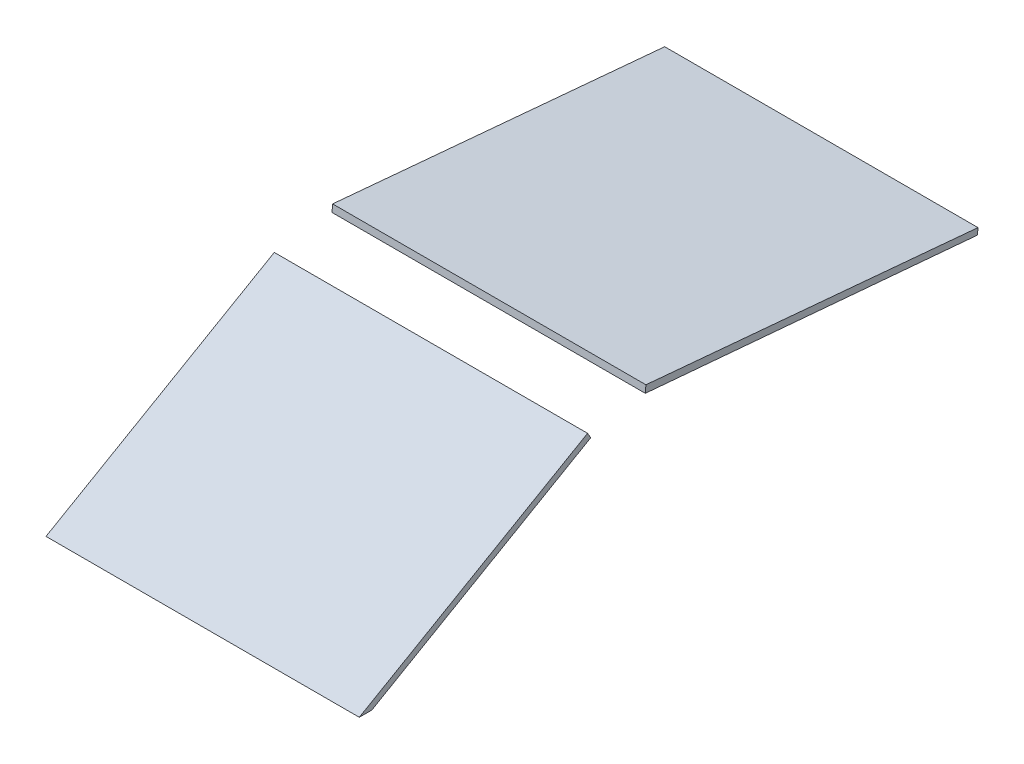
ISO-10303-21;
HEADER;
FILE_DESCRIPTION(('STEP AP214'),'2;1');
FILE_NAME('part.step','',(''),(''),'','','');
FILE_SCHEMA(('AUTOMOTIVE_DESIGN { 1 0 10303 214 1 1 1 1 }'));
ENDSEC;
DATA;
#1=APPLICATION_CONTEXT('core data for automotive mechanical design processes');
#2=APPLICATION_PROTOCOL_DEFINITION('international standard','automotive_design',2000,#1);
#3=PRODUCT_CONTEXT('',#1,'mechanical');
#4=PRODUCT('Part','Part','',(#3));
#5=PRODUCT_RELATED_PRODUCT_CATEGORY('part','',(#4));
#6=PRODUCT_DEFINITION_FORMATION('','',#4);
#7=PRODUCT_DEFINITION_CONTEXT('part definition',#1,'design');
#8=PRODUCT_DEFINITION('design','',#6,#7);
#9=PRODUCT_DEFINITION_SHAPE('','',#8);
#10=(LENGTH_UNIT() NAMED_UNIT(*) SI_UNIT(.MILLI.,.METRE.));
#11=(NAMED_UNIT(*) PLANE_ANGLE_UNIT() SI_UNIT($,.RADIAN.));
#12=(NAMED_UNIT(*) SI_UNIT($,.STERADIAN.) SOLID_ANGLE_UNIT());
#13=UNCERTAINTY_MEASURE_WITH_UNIT(LENGTH_MEASURE(1.E-05),#10,'distance_accuracy_value','');
#14=(GEOMETRIC_REPRESENTATION_CONTEXT(3) GLOBAL_UNCERTAINTY_ASSIGNED_CONTEXT((#13)) GLOBAL_UNIT_ASSIGNED_CONTEXT((#10,
#11,#12)) REPRESENTATION_CONTEXT('',''));
#15=CARTESIAN_POINT('',(0.,0.,0.));
#16=DIRECTION('',(0.,0.,1.));
#17=DIRECTION('',(1.,0.,0.));
#18=AXIS2_PLACEMENT_3D('',#15,#16,#17);
#19=CARTESIAN_POINT('',(150.,0.,0.));
#20=DIRECTION('',(1.,0.,0.));
#21=DIRECTION('',(0.,0.,-1.));
#22=AXIS2_PLACEMENT_3D('',#19,#20,#21);
#23=PLANE('',#22);
#24=DIRECTION('',(0.,0.996194698091746,-0.0871557427476543));
#25=VECTOR('',#24,1.);
#26=CARTESIAN_POINT('',(150.,69.2581878328645,-131.229386395403));
#27=LINE('',#26,#25);
#28=CARTESIAN_POINT('',(150.,65.8589819601407,-130.931994416549));
#29=VERTEX_POINT('',#28);
#30=CARTESIAN_POINT('',(150.,69.2581878328645,-131.229386395403));
#31=VERTEX_POINT('',#30);
#32=EDGE_CURVE('E57',#29,#31,#27,.T.);
#33=ORIENTED_EDGE('',*,*,#32,.F.);
#34=DIRECTION('',(0.,-0.0871557427476583,-0.996194698091746));
#35=VECTOR('',#34,1.);
#36=CARTESIAN_POINT('',(150.,67.1400000000002,-116.289891220174));
#37=LINE('',#36,#35);
#38=CARTESIAN_POINT('',(150.,51.9452678093734,-289.966474885489));
#39=VERTEX_POINT('',#38);
#40=EDGE_CURVE('E114',#29,#39,#37,.T.);
#41=ORIENTED_EDGE('',*,*,#40,.T.);
#42=DIRECTION('',(0.,0.996194698091747,-0.0871557427476465));
#43=VECTOR('',#42,1.);
#44=CARTESIAN_POINT('',(150.,51.9452678093734,-289.966474885489));
#45=LINE('',#44,#43);
#46=CARTESIAN_POINT('',(150.,54.9338519036487,-290.227942113732));
#47=VERTEX_POINT('',#46);
#48=EDGE_CURVE('E112',#39,#47,#45,.T.);
#49=ORIENTED_EDGE('',*,*,#48,.T.);
#50=DIRECTION('',(0.,0.0897275854848985,0.995966345015257));
#51=VECTOR('',#50,1.);
#52=CARTESIAN_POINT('',(150.,54.9338519036487,-290.227942113732));
#53=LINE('',#52,#51);
#54=EDGE_CURVE('E98',#47,#31,#53,.T.);
#55=ORIENTED_EDGE('',*,*,#54,.T.);
#56=EDGE_LOOP('',(#33,#41,#49,#55));
#57=FACE_BOUND('',#56,.T.);
#58=ADVANCED_FACE('F48',(#57),#23,.T.);
#59=CARTESIAN_POINT('',(0.,0.,0.));
#60=DIRECTION('',(1.,0.,0.));
#61=DIRECTION('',(0.,0.,-1.));
#62=AXIS2_PLACEMENT_3D('',#59,#60,#61);
#63=PLANE('',#62);
#64=DIRECTION('',(0.,-0.0871557427476583,-0.996194698091746));
#65=VECTOR('',#64,1.);
#66=CARTESIAN_POINT('',(0.,67.1400000000002,-116.289891220174));
#67=LINE('',#66,#65);
#68=CARTESIAN_POINT('',(0.,65.8589819601407,-130.931994416549));
#69=VERTEX_POINT('',#68);
#70=CARTESIAN_POINT('',(0.,51.9452678093734,-289.966474885489));
#71=VERTEX_POINT('',#70);
#72=EDGE_CURVE('E97',#69,#71,#67,.T.);
#73=ORIENTED_EDGE('',*,*,#72,.F.);
#74=DIRECTION('',(0.,0.996194698091746,-0.0871557427476543));
#75=VECTOR('',#74,1.);
#76=CARTESIAN_POINT('',(0.,69.2581878328645,-131.229386395403));
#77=LINE('',#76,#75);
#78=CARTESIAN_POINT('',(0.,69.2581878328645,-131.229386395403));
#79=VERTEX_POINT('',#78);
#80=EDGE_CURVE('E51',#69,#79,#77,.T.);
#81=ORIENTED_EDGE('',*,*,#80,.T.);
#82=DIRECTION('',(0.,0.0897275854848985,0.995966345015257));
#83=VECTOR('',#82,1.);
#84=CARTESIAN_POINT('',(0.,54.9338519036487,-290.227942113732));
#85=LINE('',#84,#83);
#86=CARTESIAN_POINT('',(0.,54.9338519036487,-290.227942113732));
#87=VERTEX_POINT('',#86);
#88=EDGE_CURVE('E90',#87,#79,#85,.T.);
#89=ORIENTED_EDGE('',*,*,#88,.F.);
#90=DIRECTION('',(0.,0.996194698091747,-0.0871557427476465));
#91=VECTOR('',#90,1.);
#92=CARTESIAN_POINT('',(0.,51.9452678093734,-289.966474885489));
#93=LINE('',#92,#91);
#94=EDGE_CURVE('E105',#71,#87,#93,.T.);
#95=ORIENTED_EDGE('',*,*,#94,.F.);
#96=EDGE_LOOP('',(#73,#81,#89,#95));
#97=FACE_BOUND('',#96,.T.);
#98=ADVANCED_FACE('F95',(#97),#63,.F.);
#99=CARTESIAN_POINT('',(150.,67.1400000000002,-116.289891220174));
#100=DIRECTION('',(0.,0.996194698091746,-0.0871557427476582));
#101=DIRECTION('',(0.,0.0871557427476582,0.996194698091746));
#102=AXIS2_PLACEMENT_3D('',#99,#100,#101);
#103=PLANE('',#102);
#104=ORIENTED_EDGE('',*,*,#40,.F.);
#105=DIRECTION('',(1.,0.,0.));
#106=VECTOR('',#105,1.);
#107=CARTESIAN_POINT('',(0.,65.8589819601407,-130.931994416549));
#108=LINE('',#107,#106);
#109=EDGE_CURVE('E12',#69,#29,#108,.T.);
#110=ORIENTED_EDGE('',*,*,#109,.F.);
#111=ORIENTED_EDGE('',*,*,#72,.T.);
#112=DIRECTION('',(-1.,0.,0.));
#113=VECTOR('',#112,1.);
#114=CARTESIAN_POINT('',(150.,51.9452678093734,-289.966474885489));
#115=LINE('',#114,#113);
#116=EDGE_CURVE('E102',#39,#71,#115,.T.);
#117=ORIENTED_EDGE('',*,*,#116,.F.);
#118=EDGE_LOOP('',(#104,#110,#111,#117));
#119=FACE_BOUND('',#118,.T.);
#120=ADVANCED_FACE('F120',(#119),#103,.F.);
#121=CARTESIAN_POINT('',(150.,51.9452678093734,-289.966474885489));
#122=DIRECTION('',(0.,0.0871557427476465,0.996194698091747));
#123=DIRECTION('',(0.,-0.996194698091747,0.0871557427476465));
#124=AXIS2_PLACEMENT_3D('',#121,#122,#123);
#125=PLANE('',#124);
#126=ORIENTED_EDGE('',*,*,#94,.T.);
#127=DIRECTION('',(-1.,0.,0.));
#128=VECTOR('',#127,1.);
#129=CARTESIAN_POINT('',(150.,54.9338519036487,-290.227942113732));
#130=LINE('',#129,#128);
#131=EDGE_CURVE('E89',#47,#87,#130,.T.);
#132=ORIENTED_EDGE('',*,*,#131,.F.);
#133=ORIENTED_EDGE('',*,*,#48,.F.);
#134=ORIENTED_EDGE('',*,*,#116,.T.);
#135=EDGE_LOOP('',(#126,#132,#133,#134));
#136=FACE_BOUND('',#135,.T.);
#137=ADVANCED_FACE('F122',(#136),#125,.F.);
#138=CARTESIAN_POINT('',(150.,54.9338519036487,-290.227942113732));
#139=DIRECTION('',(0.,-0.995966345015257,0.0897275854848985));
#140=DIRECTION('',(0.,-0.0897275854848985,-0.995966345015257));
#141=AXIS2_PLACEMENT_3D('',#138,#139,#140);
#142=PLANE('',#141);
#143=ORIENTED_EDGE('',*,*,#88,.T.);
#144=DIRECTION('',(1.,0.,0.));
#145=VECTOR('',#144,1.);
#146=CARTESIAN_POINT('',(0.,69.2581878328645,-131.229386395403));
#147=LINE('',#146,#145);
#148=EDGE_CURVE('E82',#79,#31,#147,.T.);
#149=ORIENTED_EDGE('',*,*,#148,.T.);
#150=ORIENTED_EDGE('',*,*,#54,.F.);
#151=ORIENTED_EDGE('',*,*,#131,.T.);
#152=EDGE_LOOP('',(#143,#149,#150,#151));
#153=FACE_BOUND('',#152,.T.);
#154=ADVANCED_FACE('F100',(#153),#142,.F.);
#155=CARTESIAN_POINT('',(0.,69.2581878328645,-131.229386395403));
#156=DIRECTION('',(0.,-0.0871557427476543,-0.996194698091746));
#157=DIRECTION('',(0.,0.996194698091746,-0.0871557427476543));
#158=AXIS2_PLACEMENT_3D('',#155,#156,#157);
#159=PLANE('',#158);
#160=ORIENTED_EDGE('',*,*,#32,.T.);
#161=ORIENTED_EDGE('',*,*,#148,.F.);
#162=ORIENTED_EDGE('',*,*,#80,.F.);
#163=ORIENTED_EDGE('',*,*,#109,.T.);
#164=EDGE_LOOP('',(#160,#161,#162,#163));
#165=FACE_BOUND('',#164,.T.);
#166=ADVANCED_FACE('F84',(#165),#159,.F.);
#167=CLOSED_SHELL('',(#58,#98,#120,#137,#154,#166));
#168=MANIFOLD_SOLID_BREP('B2',#167);
#169=CARTESIAN_POINT('',(150.,0.,5.99999999999999));
#170=DIRECTION('',(0.,1.,0.));
#171=DIRECTION('',(0.,0.,1.));
#172=AXIS2_PLACEMENT_3D('',#169,#170,#171);
#173=PLANE('',#172);
#174=DIRECTION('',(0.,0.,-1.));
#175=VECTOR('',#174,1.);
#176=CARTESIAN_POINT('',(0.,0.,5.99999999999999));
#177=LINE('',#176,#175);
#178=CARTESIAN_POINT('',(0.,0.,5.99999999999999));
#179=VERTEX_POINT('',#178);
#180=CARTESIAN_POINT('',(0.,0.,0.));
#181=VERTEX_POINT('',#180);
#182=EDGE_CURVE('E222',#179,#181,#177,.T.);
#183=ORIENTED_EDGE('',*,*,#182,.T.);
#184=DIRECTION('',(-1.,0.,0.));
#185=VECTOR('',#184,1.);
#186=CARTESIAN_POINT('',(150.,0.,0.));
#187=LINE('',#186,#185);
#188=CARTESIAN_POINT('',(150.,0.,0.));
#189=VERTEX_POINT('',#188);
#190=EDGE_CURVE('E46',#189,#181,#187,.T.);
#191=ORIENTED_EDGE('',*,*,#190,.F.);
#192=DIRECTION('',(0.,0.,-1.));
#193=VECTOR('',#192,1.);
#194=CARTESIAN_POINT('',(150.,0.,5.99999999999999));
#195=LINE('',#194,#193);
#196=CARTESIAN_POINT('',(150.,0.,5.99999999999999));
#197=VERTEX_POINT('',#196);
#198=EDGE_CURVE('E216',#197,#189,#195,.T.);
#199=ORIENTED_EDGE('',*,*,#198,.F.);
#200=DIRECTION('',(-1.,0.,0.));
#201=VECTOR('',#200,1.);
#202=CARTESIAN_POINT('',(150.,0.,5.99999999999999));
#203=LINE('',#202,#201);
#204=EDGE_CURVE('E178',#197,#179,#203,.T.);
#205=ORIENTED_EDGE('',*,*,#204,.T.);
#206=EDGE_LOOP('',(#183,#191,#199,#205));
#207=FACE_BOUND('',#206,.T.);
#208=ADVANCED_FACE('F171',(#207),#173,.F.);
#209=CARTESIAN_POINT('',(0.,0.,0.));
#210=DIRECTION('',(1.,0.,0.));
#211=DIRECTION('',(0.,0.,-1.));
#212=AXIS2_PLACEMENT_3D('',#209,#210,#211);
#213=PLANE('',#212);
#214=DIRECTION('',(0.,-0.500000000000001,0.866025403784438));
#215=VECTOR('',#214,1.);
#216=CARTESIAN_POINT('',(0.,0.,5.99999999999999));
#217=LINE('',#216,#215);
#218=CARTESIAN_POINT('',(0.,63.1041016151379,-103.299510163408));
#219=VERTEX_POINT('',#218);
#220=EDGE_CURVE('E208',#219,#179,#217,.T.);
#221=ORIENTED_EDGE('',*,*,#220,.F.);
#222=DIRECTION('',(0.,-0.866025403784437,-0.500000000000003));
#223=VECTOR('',#222,1.);
#224=CARTESIAN_POINT('',(0.,63.1041016151379,-103.299510163408));
#225=LINE('',#224,#223);
#226=CARTESIAN_POINT('',(0.,60.5060254037846,-104.799510163408));
#227=VERTEX_POINT('',#226);
#228=EDGE_CURVE('E234',#219,#227,#225,.T.);
#229=ORIENTED_EDGE('',*,*,#228,.T.);
#230=DIRECTION('',(0.,0.500000000000001,-0.866025403784438));
#231=VECTOR('',#230,1.);
#232=CARTESIAN_POINT('',(0.,0.,0.));
#233=LINE('',#232,#231);
#234=EDGE_CURVE('E217',#181,#227,#233,.T.);
#235=ORIENTED_EDGE('',*,*,#234,.F.);
#236=ORIENTED_EDGE('',*,*,#182,.F.);
#237=EDGE_LOOP('',(#221,#229,#235,#236));
#238=FACE_BOUND('',#237,.T.);
#239=ADVANCED_FACE('F223',(#238),#213,.F.);
#240=CARTESIAN_POINT('',(150.,0.,0.));
#241=DIRECTION('',(1.,0.,0.));
#242=DIRECTION('',(0.,0.,-1.));
#243=AXIS2_PLACEMENT_3D('',#240,#241,#242);
#244=PLANE('',#243);
#245=DIRECTION('',(0.,-0.866025403784437,-0.500000000000003));
#246=VECTOR('',#245,1.);
#247=CARTESIAN_POINT('',(150.,63.1041016151379,-103.299510163408));
#248=LINE('',#247,#246);
#249=CARTESIAN_POINT('',(150.,63.1041016151379,-103.299510163408));
#250=VERTEX_POINT('',#249);
#251=CARTESIAN_POINT('',(150.,60.5060254037845,-104.799510163408));
#252=VERTEX_POINT('',#251);
#253=EDGE_CURVE('E236',#250,#252,#248,.T.);
#254=ORIENTED_EDGE('',*,*,#253,.F.);
#255=DIRECTION('',(0.,-0.500000000000001,0.866025403784438));
#256=VECTOR('',#255,1.);
#257=CARTESIAN_POINT('',(150.,0.,5.99999999999999));
#258=LINE('',#257,#256);
#259=EDGE_CURVE('E194',#250,#197,#258,.T.);
#260=ORIENTED_EDGE('',*,*,#259,.T.);
#261=ORIENTED_EDGE('',*,*,#198,.T.);
#262=DIRECTION('',(0.,0.500000000000001,-0.866025403784438));
#263=VECTOR('',#262,1.);
#264=CARTESIAN_POINT('',(150.,0.,0.));
#265=LINE('',#264,#263);
#266=EDGE_CURVE('E230',#189,#252,#265,.T.);
#267=ORIENTED_EDGE('',*,*,#266,.T.);
#268=EDGE_LOOP('',(#254,#260,#261,#267));
#269=FACE_BOUND('',#268,.T.);
#270=ADVANCED_FACE('F241',(#269),#244,.T.);
#271=CARTESIAN_POINT('',(150.,0.,5.99999999999999));
#272=DIRECTION('',(0.,-0.866025403784438,-0.500000000000001));
#273=DIRECTION('',(0.,0.500000000000001,-0.866025403784438));
#274=AXIS2_PLACEMENT_3D('',#271,#272,#273);
#275=PLANE('',#274);
#276=ORIENTED_EDGE('',*,*,#259,.F.);
#277=DIRECTION('',(1.,0.,0.));
#278=VECTOR('',#277,1.);
#279=CARTESIAN_POINT('',(0.,63.1041016151379,-103.299510163408));
#280=LINE('',#279,#278);
#281=EDGE_CURVE('E213',#219,#250,#280,.T.);
#282=ORIENTED_EDGE('',*,*,#281,.F.);
#283=ORIENTED_EDGE('',*,*,#220,.T.);
#284=ORIENTED_EDGE('',*,*,#204,.F.);
#285=EDGE_LOOP('',(#276,#282,#283,#284));
#286=FACE_BOUND('',#285,.T.);
#287=ADVANCED_FACE('F210',(#286),#275,.F.);
#288=CARTESIAN_POINT('',(150.,0.,0.));
#289=DIRECTION('',(0.,0.866025403784438,0.500000000000001));
#290=DIRECTION('',(0.,-0.500000000000001,0.866025403784438));
#291=AXIS2_PLACEMENT_3D('',#288,#289,#290);
#292=PLANE('',#291);
#293=ORIENTED_EDGE('',*,*,#234,.T.);
#294=DIRECTION('',(1.,0.,0.));
#295=VECTOR('',#294,1.);
#296=CARTESIAN_POINT('',(0.,60.5060254037845,-104.799510163408));
#297=LINE('',#296,#295);
#298=EDGE_CURVE('E185',#227,#252,#297,.T.);
#299=ORIENTED_EDGE('',*,*,#298,.T.);
#300=ORIENTED_EDGE('',*,*,#266,.F.);
#301=ORIENTED_EDGE('',*,*,#190,.T.);
#302=EDGE_LOOP('',(#293,#299,#300,#301));
#303=FACE_BOUND('',#302,.T.);
#304=ADVANCED_FACE('F239',(#303),#292,.F.);
#305=CARTESIAN_POINT('',(0.,63.1041016151379,-103.299510163408));
#306=DIRECTION('',(0.,-0.500000000000003,0.866025403784437));
#307=DIRECTION('',(0.,-0.866025403784437,-0.500000000000003));
#308=AXIS2_PLACEMENT_3D('',#305,#306,#307);
#309=PLANE('',#308);
#310=ORIENTED_EDGE('',*,*,#253,.T.);
#311=ORIENTED_EDGE('',*,*,#298,.F.);
#312=ORIENTED_EDGE('',*,*,#228,.F.);
#313=ORIENTED_EDGE('',*,*,#281,.T.);
#314=EDGE_LOOP('',(#310,#311,#312,#313));
#315=FACE_BOUND('',#314,.T.);
#316=ADVANCED_FACE('F262',(#315),#309,.F.);
#317=CLOSED_SHELL('',(#208,#239,#270,#287,#304,#316));
#318=MANIFOLD_SOLID_BREP('B6',#317);
#319=ADVANCED_BREP_SHAPE_REPRESENTATION('',(#18,#168,#318),#14);
#320=SHAPE_DEFINITION_REPRESENTATION(#9,#319);
ENDSEC;
END-ISO-10303-21;
